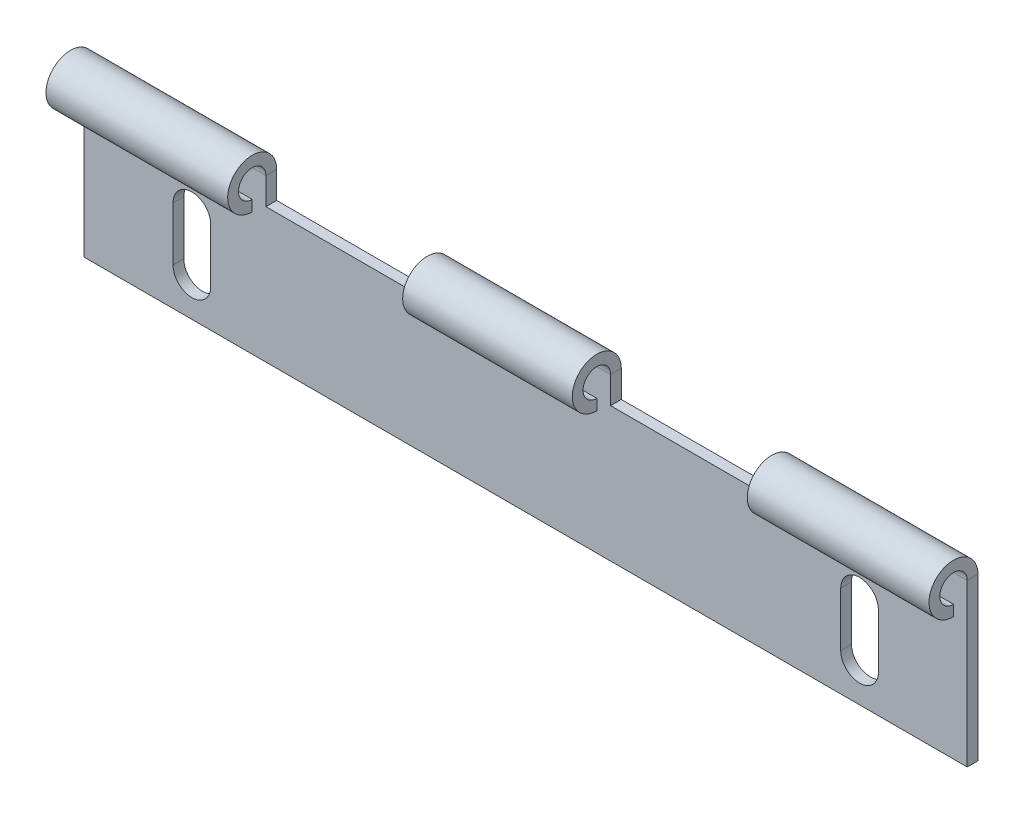
ISO-10303-21;
HEADER;
FILE_DESCRIPTION(('STEP AP214'),'2;1');
FILE_NAME('part.step','',(''),(''),'','','');
FILE_SCHEMA(('AUTOMOTIVE_DESIGN { 1 0 10303 214 1 1 1 1 }'));
ENDSEC;
DATA;
#1=APPLICATION_CONTEXT('core data for automotive mechanical design processes');
#2=APPLICATION_PROTOCOL_DEFINITION('international standard','automotive_design',2000,#1);
#3=PRODUCT_CONTEXT('',#1,'mechanical');
#4=PRODUCT('Part','Part','',(#3));
#5=PRODUCT_RELATED_PRODUCT_CATEGORY('part','',(#4));
#6=PRODUCT_DEFINITION_FORMATION('','',#4);
#7=PRODUCT_DEFINITION_CONTEXT('part definition',#1,'design');
#8=PRODUCT_DEFINITION('design','',#6,#7);
#9=PRODUCT_DEFINITION_SHAPE('','',#8);
#10=(LENGTH_UNIT() NAMED_UNIT(*) SI_UNIT(.MILLI.,.METRE.));
#11=(NAMED_UNIT(*) PLANE_ANGLE_UNIT() SI_UNIT($,.RADIAN.));
#12=(NAMED_UNIT(*) SI_UNIT($,.STERADIAN.) SOLID_ANGLE_UNIT());
#13=UNCERTAINTY_MEASURE_WITH_UNIT(LENGTH_MEASURE(1.E-05),#10,'distance_accuracy_value','');
#14=(GEOMETRIC_REPRESENTATION_CONTEXT(3) GLOBAL_UNCERTAINTY_ASSIGNED_CONTEXT((#13)) GLOBAL_UNIT_ASSIGNED_CONTEXT((#10,
#11,#12)) REPRESENTATION_CONTEXT('',''));
#15=CARTESIAN_POINT('',(0.,0.,0.));
#16=DIRECTION('',(0.,0.,1.));
#17=DIRECTION('',(1.,0.,0.));
#18=AXIS2_PLACEMENT_3D('',#15,#16,#17);
#19=CARTESIAN_POINT('',(-82.,-12.5,-2.));
#20=DIRECTION('',(0.,-1.,0.));
#21=DIRECTION('',(0.,0.,-1.));
#22=AXIS2_PLACEMENT_3D('',#19,#20,#21);
#23=PLANE('',#22);
#24=DIRECTION('',(1.,0.,0.));
#25=VECTOR('',#24,1.);
#26=CARTESIAN_POINT('',(-82.,-12.5,0.));
#27=LINE('',#26,#25);
#28=CARTESIAN_POINT('',(-82.,-12.5,0.));
#29=VERTEX_POINT('',#28);
#30=CARTESIAN_POINT('',(82.,-12.5,0.));
#31=VERTEX_POINT('',#30);
#32=EDGE_CURVE('E356',#29,#31,#27,.T.);
#33=ORIENTED_EDGE('',*,*,#32,.F.);
#34=DIRECTION('',(0.,0.,1.));
#35=VECTOR('',#34,1.);
#36=CARTESIAN_POINT('',(-82.,-12.5,-2.));
#37=LINE('',#36,#35);
#38=CARTESIAN_POINT('',(-82.,-12.5,-2.));
#39=VERTEX_POINT('',#38);
#40=EDGE_CURVE('E48',#39,#29,#37,.T.);
#41=ORIENTED_EDGE('',*,*,#40,.F.);
#42=DIRECTION('',(1.,0.,0.));
#43=VECTOR('',#42,1.);
#44=CARTESIAN_POINT('',(-82.,-12.5,-2.));
#45=LINE('',#44,#43);
#46=CARTESIAN_POINT('',(82.,-12.5,-2.));
#47=VERTEX_POINT('',#46);
#48=EDGE_CURVE('E384',#39,#47,#45,.T.);
#49=ORIENTED_EDGE('',*,*,#48,.T.);
#50=DIRECTION('',(0.,0.,1.));
#51=VECTOR('',#50,1.);
#52=CARTESIAN_POINT('',(82.,-12.5,-2.));
#53=LINE('',#52,#51);
#54=EDGE_CURVE('E11',#47,#31,#53,.T.);
#55=ORIENTED_EDGE('',*,*,#54,.T.);
#56=EDGE_LOOP('',(#33,#41,#49,#55));
#57=FACE_BOUND('',#56,.T.);
#58=ADVANCED_FACE('F39',(#57),#23,.T.);
#59=CARTESIAN_POINT('',(-82.,12.5,-2.));
#60=DIRECTION('',(-1.,0.,0.));
#61=DIRECTION('',(0.,0.,1.));
#62=AXIS2_PLACEMENT_3D('',#59,#60,#61);
#63=PLANE('',#62);
#64=DIRECTION('',(0.,-1.,0.));
#65=VECTOR('',#64,1.);
#66=CARTESIAN_POINT('',(-82.,12.5,0.));
#67=LINE('',#66,#65);
#68=CARTESIAN_POINT('',(-82.,17.5,0.));
#69=VERTEX_POINT('',#68);
#70=EDGE_CURVE('E413',#69,#29,#67,.T.);
#71=ORIENTED_EDGE('',*,*,#70,.F.);
#72=DIRECTION('',(0.,0.,1.));
#73=VECTOR('',#72,1.);
#74=CARTESIAN_POINT('',(-82.,17.5,-2.));
#75=LINE('',#74,#73);
#76=CARTESIAN_POINT('',(-82.,17.5,-2.));
#77=VERTEX_POINT('',#76);
#78=EDGE_CURVE('E419',#77,#69,#75,.T.);
#79=ORIENTED_EDGE('',*,*,#78,.F.);
#80=DIRECTION('',(0.,-1.,0.));
#81=VECTOR('',#80,1.);
#82=CARTESIAN_POINT('',(-82.,12.5,-2.));
#83=LINE('',#82,#81);
#84=EDGE_CURVE('E382',#77,#39,#83,.T.);
#85=ORIENTED_EDGE('',*,*,#84,.T.);
#86=ORIENTED_EDGE('',*,*,#40,.T.);
#87=EDGE_LOOP('',(#71,#79,#85,#86));
#88=FACE_BOUND('',#87,.T.);
#89=ADVANCED_FACE('F511',(#88),#63,.T.);
#90=CARTESIAN_POINT('',(-48.25,17.5,-2.));
#91=DIRECTION('',(1.,0.,0.));
#92=DIRECTION('',(0.,0.,-1.));
#93=AXIS2_PLACEMENT_3D('',#90,#91,#92);
#94=PLANE('',#93);
#95=DIRECTION('',(0.,1.,0.));
#96=VECTOR('',#95,1.);
#97=CARTESIAN_POINT('',(-48.25,17.5,0.));
#98=LINE('',#97,#96);
#99=CARTESIAN_POINT('',(-48.25,12.5,0.));
#100=VERTEX_POINT('',#99);
#101=CARTESIAN_POINT('',(-48.25,17.5,0.));
#102=VERTEX_POINT('',#101);
#103=EDGE_CURVE('E408',#100,#102,#98,.T.);
#104=ORIENTED_EDGE('',*,*,#103,.F.);
#105=DIRECTION('',(0.,0.,1.));
#106=VECTOR('',#105,1.);
#107=CARTESIAN_POINT('',(-48.25,12.5,-2.));
#108=LINE('',#107,#106);
#109=CARTESIAN_POINT('',(-48.25,12.5,-2.));
#110=VERTEX_POINT('',#109);
#111=EDGE_CURVE('E424',#110,#100,#108,.T.);
#112=ORIENTED_EDGE('',*,*,#111,.F.);
#113=DIRECTION('',(0.,1.,0.));
#114=VECTOR('',#113,1.);
#115=CARTESIAN_POINT('',(-48.25,17.5,-2.));
#116=LINE('',#115,#114);
#117=CARTESIAN_POINT('',(-48.25,17.5,-2.));
#118=VERTEX_POINT('',#117);
#119=EDGE_CURVE('E376',#110,#118,#116,.T.);
#120=ORIENTED_EDGE('',*,*,#119,.T.);
#121=DIRECTION('',(0.,0.,1.));
#122=VECTOR('',#121,1.);
#123=CARTESIAN_POINT('',(-48.25,17.5,-2.));
#124=LINE('',#123,#122);
#125=EDGE_CURVE('E422',#118,#102,#124,.T.);
#126=ORIENTED_EDGE('',*,*,#125,.T.);
#127=EDGE_LOOP('',(#104,#112,#120,#126));
#128=FACE_BOUND('',#127,.T.);
#129=ADVANCED_FACE('F531',(#128),#94,.T.);
#130=CARTESIAN_POINT('',(-48.25,12.5,-2.));
#131=DIRECTION('',(0.,1.,0.));
#132=DIRECTION('',(0.,0.,1.));
#133=AXIS2_PLACEMENT_3D('',#130,#131,#132);
#134=PLANE('',#133);
#135=DIRECTION('',(-1.,0.,0.));
#136=VECTOR('',#135,1.);
#137=CARTESIAN_POINT('',(-48.25,12.5,0.));
#138=LINE('',#137,#136);
#139=CARTESIAN_POINT('',(-15.75,12.5,0.));
#140=VERTEX_POINT('',#139);
#141=EDGE_CURVE('E405',#140,#100,#138,.T.);
#142=ORIENTED_EDGE('',*,*,#141,.F.);
#143=DIRECTION('',(0.,0.,1.));
#144=VECTOR('',#143,1.);
#145=CARTESIAN_POINT('',(-15.75,12.5,-2.));
#146=LINE('',#145,#144);
#147=CARTESIAN_POINT('',(-15.75,12.5,-2.));
#148=VERTEX_POINT('',#147);
#149=EDGE_CURVE('E426',#148,#140,#146,.T.);
#150=ORIENTED_EDGE('',*,*,#149,.F.);
#151=DIRECTION('',(-1.,0.,0.));
#152=VECTOR('',#151,1.);
#153=CARTESIAN_POINT('',(-48.25,12.5,-2.));
#154=LINE('',#153,#152);
#155=EDGE_CURVE('E373',#148,#110,#154,.T.);
#156=ORIENTED_EDGE('',*,*,#155,.T.);
#157=ORIENTED_EDGE('',*,*,#111,.T.);
#158=EDGE_LOOP('',(#142,#150,#156,#157));
#159=FACE_BOUND('',#158,.T.);
#160=ADVANCED_FACE('F489',(#159),#134,.T.);
#161=CARTESIAN_POINT('',(-15.75,12.5,-2.));
#162=DIRECTION('',(-1.,0.,0.));
#163=DIRECTION('',(0.,0.,1.));
#164=AXIS2_PLACEMENT_3D('',#161,#162,#163);
#165=PLANE('',#164);
#166=DIRECTION('',(0.,-1.,0.));
#167=VECTOR('',#166,1.);
#168=CARTESIAN_POINT('',(-15.75,12.5,0.));
#169=LINE('',#168,#167);
#170=CARTESIAN_POINT('',(-15.75,17.5,0.));
#171=VERTEX_POINT('',#170);
#172=EDGE_CURVE('E402',#171,#140,#169,.T.);
#173=ORIENTED_EDGE('',*,*,#172,.F.);
#174=DIRECTION('',(0.,0.,1.));
#175=VECTOR('',#174,1.);
#176=CARTESIAN_POINT('',(-15.75,17.5,-2.));
#177=LINE('',#176,#175);
#178=CARTESIAN_POINT('',(-15.75,17.5,-2.));
#179=VERTEX_POINT('',#178);
#180=EDGE_CURVE('E428',#179,#171,#177,.T.);
#181=ORIENTED_EDGE('',*,*,#180,.F.);
#182=DIRECTION('',(0.,-1.,0.));
#183=VECTOR('',#182,1.);
#184=CARTESIAN_POINT('',(-15.75,12.5,-2.));
#185=LINE('',#184,#183);
#186=EDGE_CURVE('E370',#179,#148,#185,.T.);
#187=ORIENTED_EDGE('',*,*,#186,.T.);
#188=ORIENTED_EDGE('',*,*,#149,.T.);
#189=EDGE_LOOP('',(#173,#181,#187,#188));
#190=FACE_BOUND('',#189,.T.);
#191=ADVANCED_FACE('F486',(#190),#165,.T.);
#192=CARTESIAN_POINT('',(15.75,17.5,-2.));
#193=DIRECTION('',(1.,0.,0.));
#194=DIRECTION('',(0.,0.,-1.));
#195=AXIS2_PLACEMENT_3D('',#192,#193,#194);
#196=PLANE('',#195);
#197=DIRECTION('',(0.,1.,0.));
#198=VECTOR('',#197,1.);
#199=CARTESIAN_POINT('',(15.75,17.5,0.));
#200=LINE('',#199,#198);
#201=CARTESIAN_POINT('',(15.75,12.5,0.));
#202=VERTEX_POINT('',#201);
#203=CARTESIAN_POINT('',(15.75,17.5,0.));
#204=VERTEX_POINT('',#203);
#205=EDGE_CURVE('E397',#202,#204,#200,.T.);
#206=ORIENTED_EDGE('',*,*,#205,.F.);
#207=DIRECTION('',(0.,0.,1.));
#208=VECTOR('',#207,1.);
#209=CARTESIAN_POINT('',(15.75,12.5,-2.));
#210=LINE('',#209,#208);
#211=CARTESIAN_POINT('',(15.75,12.5,-2.));
#212=VERTEX_POINT('',#211);
#213=EDGE_CURVE('E432',#212,#202,#210,.T.);
#214=ORIENTED_EDGE('',*,*,#213,.F.);
#215=DIRECTION('',(0.,1.,0.));
#216=VECTOR('',#215,1.);
#217=CARTESIAN_POINT('',(15.75,17.5,-2.));
#218=LINE('',#217,#216);
#219=CARTESIAN_POINT('',(15.75,17.5,-2.));
#220=VERTEX_POINT('',#219);
#221=EDGE_CURVE('E365',#212,#220,#218,.T.);
#222=ORIENTED_EDGE('',*,*,#221,.T.);
#223=DIRECTION('',(0.,0.,1.));
#224=VECTOR('',#223,1.);
#225=CARTESIAN_POINT('',(15.75,17.5,-2.));
#226=LINE('',#225,#224);
#227=EDGE_CURVE('E238',#220,#204,#226,.T.);
#228=ORIENTED_EDGE('',*,*,#227,.T.);
#229=EDGE_LOOP('',(#206,#214,#222,#228));
#230=FACE_BOUND('',#229,.T.);
#231=ADVANCED_FACE('F476',(#230),#196,.T.);
#232=CARTESIAN_POINT('',(15.75,12.5,-2.));
#233=DIRECTION('',(0.,1.,0.));
#234=DIRECTION('',(0.,0.,1.));
#235=AXIS2_PLACEMENT_3D('',#232,#233,#234);
#236=PLANE('',#235);
#237=DIRECTION('',(-1.,0.,0.));
#238=VECTOR('',#237,1.);
#239=CARTESIAN_POINT('',(15.75,12.5,0.));
#240=LINE('',#239,#238);
#241=CARTESIAN_POINT('',(48.25,12.5,0.));
#242=VERTEX_POINT('',#241);
#243=EDGE_CURVE('E394',#242,#202,#240,.T.);
#244=ORIENTED_EDGE('',*,*,#243,.F.);
#245=DIRECTION('',(0.,0.,1.));
#246=VECTOR('',#245,1.);
#247=CARTESIAN_POINT('',(48.25,12.5,-2.));
#248=LINE('',#247,#246);
#249=CARTESIAN_POINT('',(48.25,12.5,-2.));
#250=VERTEX_POINT('',#249);
#251=EDGE_CURVE('E434',#250,#242,#248,.T.);
#252=ORIENTED_EDGE('',*,*,#251,.F.);
#253=DIRECTION('',(-1.,0.,0.));
#254=VECTOR('',#253,1.);
#255=CARTESIAN_POINT('',(15.75,12.5,-2.));
#256=LINE('',#255,#254);
#257=EDGE_CURVE('E362',#250,#212,#256,.T.);
#258=ORIENTED_EDGE('',*,*,#257,.T.);
#259=ORIENTED_EDGE('',*,*,#213,.T.);
#260=EDGE_LOOP('',(#244,#252,#258,#259));
#261=FACE_BOUND('',#260,.T.);
#262=ADVANCED_FACE('F474',(#261),#236,.T.);
#263=CARTESIAN_POINT('',(48.25,17.5,-2.));
#264=DIRECTION('',(-1.,0.,0.));
#265=DIRECTION('',(0.,0.,1.));
#266=AXIS2_PLACEMENT_3D('',#263,#264,#265);
#267=PLANE('',#266);
#268=DIRECTION('',(0.,-1.,0.));
#269=VECTOR('',#268,1.);
#270=CARTESIAN_POINT('',(48.25,17.5,0.));
#271=LINE('',#270,#269);
#272=CARTESIAN_POINT('',(48.25,17.5,0.));
#273=VERTEX_POINT('',#272);
#274=EDGE_CURVE('E391',#273,#242,#271,.T.);
#275=ORIENTED_EDGE('',*,*,#274,.F.);
#276=DIRECTION('',(0.,0.,1.));
#277=VECTOR('',#276,1.);
#278=CARTESIAN_POINT('',(48.25,17.5,-2.));
#279=LINE('',#278,#277);
#280=CARTESIAN_POINT('',(48.25,17.5,-2.));
#281=VERTEX_POINT('',#280);
#282=EDGE_CURVE('E435',#281,#273,#279,.T.);
#283=ORIENTED_EDGE('',*,*,#282,.F.);
#284=DIRECTION('',(0.,-1.,0.));
#285=VECTOR('',#284,1.);
#286=CARTESIAN_POINT('',(48.25,17.5,-2.));
#287=LINE('',#286,#285);
#288=EDGE_CURVE('E359',#281,#250,#287,.T.);
#289=ORIENTED_EDGE('',*,*,#288,.T.);
#290=ORIENTED_EDGE('',*,*,#251,.T.);
#291=EDGE_LOOP('',(#275,#283,#289,#290));
#292=FACE_BOUND('',#291,.T.);
#293=ADVANCED_FACE('F469',(#292),#267,.T.);
#294=CARTESIAN_POINT('',(82.,12.5,-2.));
#295=DIRECTION('',(1.,0.,0.));
#296=DIRECTION('',(0.,0.,-1.));
#297=AXIS2_PLACEMENT_3D('',#294,#295,#296);
#298=PLANE('',#297);
#299=DIRECTION('',(0.,1.,0.));
#300=VECTOR('',#299,1.);
#301=CARTESIAN_POINT('',(82.,12.5,0.));
#302=LINE('',#301,#300);
#303=CARTESIAN_POINT('',(82.,17.5,0.));
#304=VERTEX_POINT('',#303);
#305=EDGE_CURVE('E346',#31,#304,#302,.T.);
#306=ORIENTED_EDGE('',*,*,#305,.F.);
#307=ORIENTED_EDGE('',*,*,#54,.F.);
#308=DIRECTION('',(0.,1.,0.));
#309=VECTOR('',#308,1.);
#310=CARTESIAN_POINT('',(82.,12.5,-2.));
#311=LINE('',#310,#309);
#312=CARTESIAN_POINT('',(82.,17.5,-2.));
#313=VERTEX_POINT('',#312);
#314=EDGE_CURVE('E353',#47,#313,#311,.T.);
#315=ORIENTED_EDGE('',*,*,#314,.T.);
#316=DIRECTION('',(0.,0.,1.));
#317=VECTOR('',#316,1.);
#318=CARTESIAN_POINT('',(82.,17.5,-2.));
#319=LINE('',#318,#317);
#320=EDGE_CURVE('E43',#313,#304,#319,.T.);
#321=ORIENTED_EDGE('',*,*,#320,.T.);
#322=EDGE_LOOP('',(#306,#307,#315,#321));
#323=FACE_BOUND('',#322,.T.);
#324=ADVANCED_FACE('F41',(#323),#298,.T.);
#325=CARTESIAN_POINT('',(0.,0.,-2.));
#326=DIRECTION('',(0.,0.,1.));
#327=DIRECTION('',(1.,0.,0.));
#328=AXIS2_PLACEMENT_3D('',#325,#326,#327);
#329=PLANE('',#328);
#330=DIRECTION('',(0.,1.,0.));
#331=VECTOR('',#330,1.);
#332=CARTESIAN_POINT('',(65.5,4.50000000000001,-2.));
#333=LINE('',#332,#331);
#334=CARTESIAN_POINT('',(65.5,-5.49999999999999,-2.));
#335=VERTEX_POINT('',#334);
#336=CARTESIAN_POINT('',(65.5,4.50000000000001,-2.));
#337=VERTEX_POINT('',#336);
#338=EDGE_CURVE('E300',#335,#337,#333,.T.);
#339=ORIENTED_EDGE('',*,*,#338,.T.);
#340=CARTESIAN_POINT('',(62.,4.50000000000001,-2.));
#341=DIRECTION('',(0.,0.,1.));
#342=DIRECTION('',(1.,0.,0.));
#343=AXIS2_PLACEMENT_3D('',#340,#341,#342);
#344=CIRCLE('',#343,3.5);
#345=CARTESIAN_POINT('',(58.5,4.50000000000001,-2.));
#346=VERTEX_POINT('',#345);
#347=EDGE_CURVE('E292',#337,#346,#344,.T.);
#348=ORIENTED_EDGE('',*,*,#347,.T.);
#349=DIRECTION('',(0.,-1.,0.));
#350=VECTOR('',#349,1.);
#351=CARTESIAN_POINT('',(58.5,4.50000000000001,-2.));
#352=LINE('',#351,#350);
#353=CARTESIAN_POINT('',(58.5,-5.49999999999999,-2.));
#354=VERTEX_POINT('',#353);
#355=EDGE_CURVE('E295',#346,#354,#352,.T.);
#356=ORIENTED_EDGE('',*,*,#355,.T.);
#357=CARTESIAN_POINT('',(62.,-5.49999999999999,-2.));
#358=DIRECTION('',(0.,0.,1.));
#359=DIRECTION('',(1.,0.,0.));
#360=AXIS2_PLACEMENT_3D('',#357,#358,#359);
#361=CIRCLE('',#360,3.5);
#362=EDGE_CURVE('E56',#354,#335,#361,.T.);
#363=ORIENTED_EDGE('',*,*,#362,.T.);
#364=EDGE_LOOP('',(#339,#348,#356,#363));
#365=FACE_BOUND('',#364,.T.);
#366=DIRECTION('',(0.,1.,0.));
#367=VECTOR('',#366,1.);
#368=CARTESIAN_POINT('',(-58.5,4.50000000000001,-2.));
#369=LINE('',#368,#367);
#370=CARTESIAN_POINT('',(-58.5,-5.49999999999999,-2.));
#371=VERTEX_POINT('',#370);
#372=CARTESIAN_POINT('',(-58.5,4.50000000000001,-2.));
#373=VERTEX_POINT('',#372);
#374=EDGE_CURVE('E331',#371,#373,#369,.T.);
#375=ORIENTED_EDGE('',*,*,#374,.T.);
#376=CARTESIAN_POINT('',(-62.,4.50000000000001,-2.));
#377=DIRECTION('',(0.,0.,1.));
#378=DIRECTION('',(1.,0.,0.));
#379=AXIS2_PLACEMENT_3D('',#376,#377,#378);
#380=CIRCLE('',#379,3.5);
#381=CARTESIAN_POINT('',(-65.5,4.50000000000001,-2.));
#382=VERTEX_POINT('',#381);
#383=EDGE_CURVE('E321',#373,#382,#380,.T.);
#384=ORIENTED_EDGE('',*,*,#383,.T.);
#385=DIRECTION('',(0.,-1.,0.));
#386=VECTOR('',#385,1.);
#387=CARTESIAN_POINT('',(-65.5,4.50000000000001,-2.));
#388=LINE('',#387,#386);
#389=CARTESIAN_POINT('',(-65.5,-5.49999999999999,-2.));
#390=VERTEX_POINT('',#389);
#391=EDGE_CURVE('E324',#382,#390,#388,.T.);
#392=ORIENTED_EDGE('',*,*,#391,.T.);
#393=CARTESIAN_POINT('',(-62.,-5.49999999999999,-2.));
#394=DIRECTION('',(0.,0.,1.));
#395=DIRECTION('',(1.,0.,0.));
#396=AXIS2_PLACEMENT_3D('',#393,#394,#395);
#397=CIRCLE('',#396,3.5);
#398=EDGE_CURVE('E328',#390,#371,#397,.T.);
#399=ORIENTED_EDGE('',*,*,#398,.T.);
#400=EDGE_LOOP('',(#375,#384,#392,#399));
#401=FACE_BOUND('',#400,.T.);
#402=ORIENTED_EDGE('',*,*,#314,.F.);
#403=ORIENTED_EDGE('',*,*,#48,.F.);
#404=ORIENTED_EDGE('',*,*,#84,.F.);
#405=DIRECTION('',(-1.,0.,0.));
#406=VECTOR('',#405,1.);
#407=CARTESIAN_POINT('',(-82.,17.5,-2.));
#408=LINE('',#407,#406);
#409=EDGE_CURVE('E379',#118,#77,#408,.T.);
#410=ORIENTED_EDGE('',*,*,#409,.F.);
#411=ORIENTED_EDGE('',*,*,#119,.F.);
#412=ORIENTED_EDGE('',*,*,#155,.F.);
#413=ORIENTED_EDGE('',*,*,#186,.F.);
#414=DIRECTION('',(-1.,0.,0.));
#415=VECTOR('',#414,1.);
#416=CARTESIAN_POINT('',(-15.75,17.5,-2.));
#417=LINE('',#416,#415);
#418=EDGE_CURVE('E368',#220,#179,#417,.T.);
#419=ORIENTED_EDGE('',*,*,#418,.F.);
#420=ORIENTED_EDGE('',*,*,#221,.F.);
#421=ORIENTED_EDGE('',*,*,#257,.F.);
#422=ORIENTED_EDGE('',*,*,#288,.F.);
#423=DIRECTION('',(-1.,0.,0.));
#424=VECTOR('',#423,1.);
#425=CARTESIAN_POINT('',(82.,17.5,-2.));
#426=LINE('',#425,#424);
#427=EDGE_CURVE('E355',#313,#281,#426,.T.);
#428=ORIENTED_EDGE('',*,*,#427,.F.);
#429=EDGE_LOOP('',(#402,#403,#404,#410,#411,#412,#413,#419,#420,#421,#422,#428));
#430=FACE_BOUND('',#429,.T.);
#431=ADVANCED_FACE('F464',(#365,#401,#430),#329,.F.);
#432=CARTESIAN_POINT('',(0.,0.,0.));
#433=DIRECTION('',(0.,0.,1.));
#434=DIRECTION('',(1.,0.,0.));
#435=AXIS2_PLACEMENT_3D('',#432,#433,#434);
#436=PLANE('',#435);
#437=CARTESIAN_POINT('',(62.,4.50000000000001,0.));
#438=DIRECTION('',(0.,0.,1.));
#439=DIRECTION('',(1.,0.,0.));
#440=AXIS2_PLACEMENT_3D('',#437,#438,#439);
#441=CIRCLE('',#440,3.5);
#442=CARTESIAN_POINT('',(65.5,4.50000000000001,0.));
#443=VERTEX_POINT('',#442);
#444=CARTESIAN_POINT('',(58.5,4.50000000000001,0.));
#445=VERTEX_POINT('',#444);
#446=EDGE_CURVE('E64',#443,#445,#441,.T.);
#447=ORIENTED_EDGE('',*,*,#446,.F.);
#448=DIRECTION('',(0.,1.,0.));
#449=VECTOR('',#448,1.);
#450=CARTESIAN_POINT('',(65.5,4.50000000000001,0.));
#451=LINE('',#450,#449);
#452=CARTESIAN_POINT('',(65.5,-5.49999999999999,0.));
#453=VERTEX_POINT('',#452);
#454=EDGE_CURVE('E296',#453,#443,#451,.T.);
#455=ORIENTED_EDGE('',*,*,#454,.F.);
#456=CARTESIAN_POINT('',(62.,-5.49999999999999,0.));
#457=DIRECTION('',(0.,0.,1.));
#458=DIRECTION('',(1.,0.,0.));
#459=AXIS2_PLACEMENT_3D('',#456,#457,#458);
#460=CIRCLE('',#459,3.5);
#461=CARTESIAN_POINT('',(58.5,-5.49999999999999,0.));
#462=VERTEX_POINT('',#461);
#463=EDGE_CURVE('E308',#462,#453,#460,.T.);
#464=ORIENTED_EDGE('',*,*,#463,.F.);
#465=DIRECTION('',(0.,-1.,0.));
#466=VECTOR('',#465,1.);
#467=CARTESIAN_POINT('',(58.5,4.50000000000001,0.));
#468=LINE('',#467,#466);
#469=EDGE_CURVE('E305',#445,#462,#468,.T.);
#470=ORIENTED_EDGE('',*,*,#469,.F.);
#471=EDGE_LOOP('',(#447,#455,#464,#470));
#472=FACE_BOUND('',#471,.T.);
#473=CARTESIAN_POINT('',(-62.,4.50000000000001,0.));
#474=DIRECTION('',(0.,0.,1.));
#475=DIRECTION('',(1.,0.,0.));
#476=AXIS2_PLACEMENT_3D('',#473,#474,#475);
#477=CIRCLE('',#476,3.5);
#478=CARTESIAN_POINT('',(-58.5,4.50000000000001,0.));
#479=VERTEX_POINT('',#478);
#480=CARTESIAN_POINT('',(-65.5,4.50000000000001,0.));
#481=VERTEX_POINT('',#480);
#482=EDGE_CURVE('E315',#479,#481,#477,.T.);
#483=ORIENTED_EDGE('',*,*,#482,.F.);
#484=DIRECTION('',(0.,1.,0.));
#485=VECTOR('',#484,1.);
#486=CARTESIAN_POINT('',(-58.5,4.50000000000001,0.));
#487=LINE('',#486,#485);
#488=CARTESIAN_POINT('',(-58.5,-5.49999999999999,0.));
#489=VERTEX_POINT('',#488);
#490=EDGE_CURVE('E325',#489,#479,#487,.T.);
#491=ORIENTED_EDGE('',*,*,#490,.F.);
#492=CARTESIAN_POINT('',(-62.,-5.49999999999999,0.));
#493=DIRECTION('',(0.,0.,1.));
#494=DIRECTION('',(1.,0.,0.));
#495=AXIS2_PLACEMENT_3D('',#492,#493,#494);
#496=CIRCLE('',#495,3.5);
#497=CARTESIAN_POINT('',(-65.5,-5.49999999999999,0.));
#498=VERTEX_POINT('',#497);
#499=EDGE_CURVE('E339',#498,#489,#496,.T.);
#500=ORIENTED_EDGE('',*,*,#499,.F.);
#501=DIRECTION('',(0.,-1.,0.));
#502=VECTOR('',#501,1.);
#503=CARTESIAN_POINT('',(-65.5,4.50000000000001,0.));
#504=LINE('',#503,#502);
#505=EDGE_CURVE('E336',#481,#498,#504,.T.);
#506=ORIENTED_EDGE('',*,*,#505,.F.);
#507=EDGE_LOOP('',(#483,#491,#500,#506));
#508=FACE_BOUND('',#507,.T.);
#509=ORIENTED_EDGE('',*,*,#32,.T.);
#510=ORIENTED_EDGE('',*,*,#305,.T.);
#511=DIRECTION('',(-1.,0.,0.));
#512=VECTOR('',#511,1.);
#513=CARTESIAN_POINT('',(82.,17.5,0.));
#514=LINE('',#513,#512);
#515=EDGE_CURVE('E389',#304,#273,#514,.T.);
#516=ORIENTED_EDGE('',*,*,#515,.T.);
#517=ORIENTED_EDGE('',*,*,#274,.T.);
#518=ORIENTED_EDGE('',*,*,#243,.T.);
#519=ORIENTED_EDGE('',*,*,#205,.T.);
#520=DIRECTION('',(-1.,0.,0.));
#521=VECTOR('',#520,1.);
#522=CARTESIAN_POINT('',(-15.75,17.5,0.));
#523=LINE('',#522,#521);
#524=EDGE_CURVE('E400',#204,#171,#523,.T.);
#525=ORIENTED_EDGE('',*,*,#524,.T.);
#526=ORIENTED_EDGE('',*,*,#172,.T.);
#527=ORIENTED_EDGE('',*,*,#141,.T.);
#528=ORIENTED_EDGE('',*,*,#103,.T.);
#529=DIRECTION('',(-1.,0.,0.));
#530=VECTOR('',#529,1.);
#531=CARTESIAN_POINT('',(-82.,17.5,0.));
#532=LINE('',#531,#530);
#533=EDGE_CURVE('E411',#102,#69,#532,.T.);
#534=ORIENTED_EDGE('',*,*,#533,.T.);
#535=ORIENTED_EDGE('',*,*,#70,.T.);
#536=EDGE_LOOP('',(#509,#510,#516,#517,#518,#519,#525,#526,#527,#528,#534,#535));
#537=FACE_BOUND('',#536,.T.);
#538=ADVANCED_FACE('F448',(#472,#508,#537),#436,.T.);
#539=CARTESIAN_POINT('',(-62.,4.50000000000001,-2.));
#540=DIRECTION('',(0.,0.,1.));
#541=DIRECTION('',(1.,0.,0.));
#542=AXIS2_PLACEMENT_3D('',#539,#540,#541);
#543=CYLINDRICAL_SURFACE('',#542,3.5);
#544=ORIENTED_EDGE('',*,*,#482,.T.);
#545=DIRECTION('',(0.,0.,1.));
#546=VECTOR('',#545,1.);
#547=CARTESIAN_POINT('',(-65.5,4.50000000000001,-2.));
#548=LINE('',#547,#546);
#549=EDGE_CURVE('E334',#382,#481,#548,.T.);
#550=ORIENTED_EDGE('',*,*,#549,.F.);
#551=ORIENTED_EDGE('',*,*,#383,.F.);
#552=DIRECTION('',(0.,0.,1.));
#553=VECTOR('',#552,1.);
#554=CARTESIAN_POINT('',(-58.5,4.50000000000001,-2.));
#555=LINE('',#554,#553);
#556=EDGE_CURVE('E344',#373,#479,#555,.T.);
#557=ORIENTED_EDGE('',*,*,#556,.T.);
#558=EDGE_LOOP('',(#544,#550,#551,#557));
#559=FACE_BOUND('',#558,.T.);
#560=ADVANCED_FACE('F556',(#559),#543,.F.);
#561=CARTESIAN_POINT('',(-58.5,4.50000000000001,-2.));
#562=DIRECTION('',(1.,0.,0.));
#563=DIRECTION('',(0.,0.,-1.));
#564=AXIS2_PLACEMENT_3D('',#561,#562,#563);
#565=PLANE('',#564);
#566=ORIENTED_EDGE('',*,*,#490,.T.);
#567=ORIENTED_EDGE('',*,*,#556,.F.);
#568=ORIENTED_EDGE('',*,*,#374,.F.);
#569=DIRECTION('',(0.,0.,1.));
#570=VECTOR('',#569,1.);
#571=CARTESIAN_POINT('',(-58.5,-5.49999999999999,-2.));
#572=LINE('',#571,#570);
#573=EDGE_CURVE('E347',#371,#489,#572,.T.);
#574=ORIENTED_EDGE('',*,*,#573,.T.);
#575=EDGE_LOOP('',(#566,#567,#568,#574));
#576=FACE_BOUND('',#575,.T.);
#577=ADVANCED_FACE('F562',(#576),#565,.F.);
#578=CARTESIAN_POINT('',(-62.,-5.49999999999999,-2.));
#579=DIRECTION('',(0.,0.,1.));
#580=DIRECTION('',(1.,0.,0.));
#581=AXIS2_PLACEMENT_3D('',#578,#579,#580);
#582=CYLINDRICAL_SURFACE('',#581,3.5);
#583=ORIENTED_EDGE('',*,*,#499,.T.);
#584=ORIENTED_EDGE('',*,*,#573,.F.);
#585=ORIENTED_EDGE('',*,*,#398,.F.);
#586=DIRECTION('',(0.,0.,1.));
#587=VECTOR('',#586,1.);
#588=CARTESIAN_POINT('',(-65.5,-5.49999999999999,-2.));
#589=LINE('',#588,#587);
#590=EDGE_CURVE('E349',#390,#498,#589,.T.);
#591=ORIENTED_EDGE('',*,*,#590,.T.);
#592=EDGE_LOOP('',(#583,#584,#585,#591));
#593=FACE_BOUND('',#592,.T.);
#594=ADVANCED_FACE('F568',(#593),#582,.F.);
#595=CARTESIAN_POINT('',(-65.5,4.50000000000001,-2.));
#596=DIRECTION('',(-1.,0.,0.));
#597=DIRECTION('',(0.,0.,1.));
#598=AXIS2_PLACEMENT_3D('',#595,#596,#597);
#599=PLANE('',#598);
#600=ORIENTED_EDGE('',*,*,#505,.T.);
#601=ORIENTED_EDGE('',*,*,#590,.F.);
#602=ORIENTED_EDGE('',*,*,#391,.F.);
#603=ORIENTED_EDGE('',*,*,#549,.T.);
#604=EDGE_LOOP('',(#600,#601,#602,#603));
#605=FACE_BOUND('',#604,.T.);
#606=ADVANCED_FACE('F564',(#605),#599,.F.);
#607=CARTESIAN_POINT('',(62.,4.50000000000001,-2.));
#608=DIRECTION('',(0.,0.,1.));
#609=DIRECTION('',(1.,0.,0.));
#610=AXIS2_PLACEMENT_3D('',#607,#608,#609);
#611=CYLINDRICAL_SURFACE('',#610,3.5);
#612=ORIENTED_EDGE('',*,*,#446,.T.);
#613=DIRECTION('',(0.,0.,1.));
#614=VECTOR('',#613,1.);
#615=CARTESIAN_POINT('',(58.5,4.50000000000001,-2.));
#616=LINE('',#615,#614);
#617=EDGE_CURVE('E303',#346,#445,#616,.T.);
#618=ORIENTED_EDGE('',*,*,#617,.F.);
#619=ORIENTED_EDGE('',*,*,#347,.F.);
#620=DIRECTION('',(0.,0.,1.));
#621=VECTOR('',#620,1.);
#622=CARTESIAN_POINT('',(65.5,4.50000000000001,-2.));
#623=LINE('',#622,#621);
#624=EDGE_CURVE('E313',#337,#443,#623,.T.);
#625=ORIENTED_EDGE('',*,*,#624,.T.);
#626=EDGE_LOOP('',(#612,#618,#619,#625));
#627=FACE_BOUND('',#626,.T.);
#628=ADVANCED_FACE('F567',(#627),#611,.F.);
#629=CARTESIAN_POINT('',(65.5,4.50000000000001,-2.));
#630=DIRECTION('',(1.,0.,0.));
#631=DIRECTION('',(0.,0.,-1.));
#632=AXIS2_PLACEMENT_3D('',#629,#630,#631);
#633=PLANE('',#632);
#634=ORIENTED_EDGE('',*,*,#454,.T.);
#635=ORIENTED_EDGE('',*,*,#624,.F.);
#636=ORIENTED_EDGE('',*,*,#338,.F.);
#637=DIRECTION('',(0.,0.,1.));
#638=VECTOR('',#637,1.);
#639=CARTESIAN_POINT('',(65.5,-5.49999999999999,-2.));
#640=LINE('',#639,#638);
#641=EDGE_CURVE('E316',#335,#453,#640,.T.);
#642=ORIENTED_EDGE('',*,*,#641,.T.);
#643=EDGE_LOOP('',(#634,#635,#636,#642));
#644=FACE_BOUND('',#643,.T.);
#645=ADVANCED_FACE('F578',(#644),#633,.F.);
#646=CARTESIAN_POINT('',(62.,-5.49999999999999,-2.));
#647=DIRECTION('',(0.,0.,1.));
#648=DIRECTION('',(1.,0.,0.));
#649=AXIS2_PLACEMENT_3D('',#646,#647,#648);
#650=CYLINDRICAL_SURFACE('',#649,3.5);
#651=ORIENTED_EDGE('',*,*,#463,.T.);
#652=ORIENTED_EDGE('',*,*,#641,.F.);
#653=ORIENTED_EDGE('',*,*,#362,.F.);
#654=DIRECTION('',(0.,0.,1.));
#655=VECTOR('',#654,1.);
#656=CARTESIAN_POINT('',(58.5,-5.49999999999999,-2.));
#657=LINE('',#656,#655);
#658=EDGE_CURVE('E318',#354,#462,#657,.T.);
#659=ORIENTED_EDGE('',*,*,#658,.T.);
#660=EDGE_LOOP('',(#651,#652,#653,#659));
#661=FACE_BOUND('',#660,.T.);
#662=ADVANCED_FACE('F582',(#661),#650,.F.);
#663=CARTESIAN_POINT('',(58.5,4.50000000000001,-2.));
#664=DIRECTION('',(-1.,0.,0.));
#665=DIRECTION('',(0.,0.,1.));
#666=AXIS2_PLACEMENT_3D('',#663,#664,#665);
#667=PLANE('',#666);
#668=ORIENTED_EDGE('',*,*,#469,.T.);
#669=ORIENTED_EDGE('',*,*,#658,.F.);
#670=ORIENTED_EDGE('',*,*,#355,.F.);
#671=ORIENTED_EDGE('',*,*,#617,.T.);
#672=EDGE_LOOP('',(#668,#669,#670,#671));
#673=FACE_BOUND('',#672,.T.);
#674=ADVANCED_FACE('F579',(#673),#667,.F.);
#675=CARTESIAN_POINT('',(-65.125,14.95,2.54999999999997));
#676=DIRECTION('',(0.,0.,1.));
#677=DIRECTION('',(-1.,0.,0.));
#678=AXIS2_PLACEMENT_3D('',#675,#676,#677);
#679=PLANE('',#678);
#680=DIRECTION('',(0.,-1.,0.));
#681=VECTOR('',#680,1.);
#682=CARTESIAN_POINT('',(-82.,14.95,2.54999999999997));
#683=LINE('',#682,#681);
#684=CARTESIAN_POINT('',(-82.,14.95,2.54999999999997));
#685=VERTEX_POINT('',#684);
#686=CARTESIAN_POINT('',(-82.,12.95,2.54999999999995));
#687=VERTEX_POINT('',#686);
#688=EDGE_CURVE('E290',#685,#687,#683,.T.);
#689=ORIENTED_EDGE('',*,*,#688,.F.);
#690=DIRECTION('',(-1.,0.,0.));
#691=VECTOR('',#690,1.);
#692=CARTESIAN_POINT('',(-82.,14.95,2.54999999999997));
#693=LINE('',#692,#691);
#694=CARTESIAN_POINT('',(-48.25,14.95,2.54999999999997));
#695=VERTEX_POINT('',#694);
#696=EDGE_CURVE('E270',#695,#685,#693,.T.);
#697=ORIENTED_EDGE('',*,*,#696,.F.);
#698=DIRECTION('',(0.,-1.,0.));
#699=VECTOR('',#698,1.);
#700=CARTESIAN_POINT('',(-48.25,14.95,2.54999999999997));
#701=LINE('',#700,#699);
#702=CARTESIAN_POINT('',(-48.25,12.95,2.54999999999995));
#703=VERTEX_POINT('',#702);
#704=EDGE_CURVE('E274',#695,#703,#701,.T.);
#705=ORIENTED_EDGE('',*,*,#704,.T.);
#706=DIRECTION('',(-1.,0.,0.));
#707=VECTOR('',#706,1.);
#708=CARTESIAN_POINT('',(-82.,12.95,2.54999999999995));
#709=LINE('',#708,#707);
#710=EDGE_CURVE('E276',#703,#687,#709,.T.);
#711=ORIENTED_EDGE('',*,*,#710,.T.);
#712=EDGE_LOOP('',(#689,#697,#705,#711));
#713=FACE_BOUND('',#712,.T.);
#714=ADVANCED_FACE('F505',(#713),#679,.F.);
#715=CARTESIAN_POINT('',(-48.25,17.5,2.55));
#716=DIRECTION('',(1.,0.,0.));
#717=DIRECTION('',(0.,0.,-1.));
#718=AXIS2_PLACEMENT_3D('',#715,#716,#717);
#719=PLANE('',#718);
#720=ORIENTED_EDGE('',*,*,#704,.F.);
#721=CARTESIAN_POINT('',(-48.25,17.5,2.55));
#722=DIRECTION('',(-1.,0.,0.));
#723=DIRECTION('',(0.,0.,1.));
#724=AXIS2_PLACEMENT_3D('',#721,#722,#723);
#725=CIRCLE('',#724,2.55);
#726=EDGE_CURVE('E279',#102,#695,#725,.F.);
#727=ORIENTED_EDGE('',*,*,#726,.F.);
#728=ORIENTED_EDGE('',*,*,#125,.F.);
#729=CARTESIAN_POINT('',(-48.25,17.5,2.55));
#730=DIRECTION('',(-1.,0.,0.));
#731=DIRECTION('',(0.,0.,1.));
#732=AXIS2_PLACEMENT_3D('',#729,#730,#731);
#733=CIRCLE('',#732,4.55);
#734=EDGE_CURVE('E271',#118,#703,#733,.F.);
#735=ORIENTED_EDGE('',*,*,#734,.T.);
#736=EDGE_LOOP('',(#720,#727,#728,#735));
#737=FACE_BOUND('',#736,.T.);
#738=ADVANCED_FACE('F500',(#737),#719,.T.);
#739=CARTESIAN_POINT('',(-82.,17.5,2.55));
#740=DIRECTION('',(1.,0.,0.));
#741=DIRECTION('',(0.,0.,-1.));
#742=AXIS2_PLACEMENT_3D('',#739,#740,#741);
#743=PLANE('',#742);
#744=CARTESIAN_POINT('',(-82.,17.5,2.55));
#745=DIRECTION('',(-1.,0.,0.));
#746=DIRECTION('',(0.,0.,1.));
#747=AXIS2_PLACEMENT_3D('',#744,#745,#746);
#748=CIRCLE('',#747,2.55);
#749=EDGE_CURVE('E284',#685,#69,#748,.T.);
#750=ORIENTED_EDGE('',*,*,#749,.F.);
#751=ORIENTED_EDGE('',*,*,#688,.T.);
#752=CARTESIAN_POINT('',(-82.,17.5,2.55));
#753=DIRECTION('',(-1.,0.,0.));
#754=DIRECTION('',(0.,0.,1.));
#755=AXIS2_PLACEMENT_3D('',#752,#753,#754);
#756=CIRCLE('',#755,4.55);
#757=EDGE_CURVE('E275',#687,#77,#756,.T.);
#758=ORIENTED_EDGE('',*,*,#757,.T.);
#759=ORIENTED_EDGE('',*,*,#78,.T.);
#760=EDGE_LOOP('',(#750,#751,#758,#759));
#761=FACE_BOUND('',#760,.T.);
#762=ADVANCED_FACE('F507',(#761),#743,.F.);
#763=CARTESIAN_POINT('',(-82.,17.5,2.55));
#764=DIRECTION('',(-1.,0.,0.));
#765=DIRECTION('',(0.,-1.,0.));
#766=AXIS2_PLACEMENT_3D('',#763,#764,#765);
#767=CYLINDRICAL_SURFACE('',#766,4.55);
#768=ORIENTED_EDGE('',*,*,#409,.T.);
#769=ORIENTED_EDGE('',*,*,#757,.F.);
#770=ORIENTED_EDGE('',*,*,#710,.F.);
#771=ORIENTED_EDGE('',*,*,#734,.F.);
#772=EDGE_LOOP('',(#768,#769,#770,#771));
#773=FACE_BOUND('',#772,.T.);
#774=ADVANCED_FACE('F515',(#773),#767,.T.);
#775=CARTESIAN_POINT('',(-82.,17.5,2.55));
#776=DIRECTION('',(-1.,0.,0.));
#777=DIRECTION('',(0.,-1.,0.));
#778=AXIS2_PLACEMENT_3D('',#775,#776,#777);
#779=CYLINDRICAL_SURFACE('',#778,2.55);
#780=ORIENTED_EDGE('',*,*,#533,.F.);
#781=ORIENTED_EDGE('',*,*,#726,.T.);
#782=ORIENTED_EDGE('',*,*,#696,.T.);
#783=ORIENTED_EDGE('',*,*,#749,.T.);
#784=EDGE_LOOP('',(#780,#781,#782,#783));
#785=FACE_BOUND('',#784,.T.);
#786=ADVANCED_FACE('F496',(#785),#779,.F.);
#787=CARTESIAN_POINT('',(65.125,14.95,2.54999999999997));
#788=DIRECTION('',(0.,0.,1.));
#789=DIRECTION('',(-1.,0.,0.));
#790=AXIS2_PLACEMENT_3D('',#787,#788,#789);
#791=PLANE('',#790);
#792=DIRECTION('',(0.,-1.,0.));
#793=VECTOR('',#792,1.);
#794=CARTESIAN_POINT('',(48.25,14.95,2.54999999999997));
#795=LINE('',#794,#793);
#796=CARTESIAN_POINT('',(48.25,14.95,2.54999999999997));
#797=VERTEX_POINT('',#796);
#798=CARTESIAN_POINT('',(48.25,12.95,2.54999999999995));
#799=VERTEX_POINT('',#798);
#800=EDGE_CURVE('E268',#797,#799,#795,.T.);
#801=ORIENTED_EDGE('',*,*,#800,.F.);
#802=DIRECTION('',(-1.,0.,0.));
#803=VECTOR('',#802,1.);
#804=CARTESIAN_POINT('',(48.25,14.95,2.54999999999997));
#805=LINE('',#804,#803);
#806=CARTESIAN_POINT('',(82.,14.95,2.54999999999997));
#807=VERTEX_POINT('',#806);
#808=EDGE_CURVE('E248',#807,#797,#805,.T.);
#809=ORIENTED_EDGE('',*,*,#808,.F.);
#810=DIRECTION('',(0.,-1.,0.));
#811=VECTOR('',#810,1.);
#812=CARTESIAN_POINT('',(82.,14.95,2.54999999999997));
#813=LINE('',#812,#811);
#814=CARTESIAN_POINT('',(82.,12.95,2.54999999999995));
#815=VERTEX_POINT('',#814);
#816=EDGE_CURVE('E252',#807,#815,#813,.T.);
#817=ORIENTED_EDGE('',*,*,#816,.T.);
#818=DIRECTION('',(-1.,0.,0.));
#819=VECTOR('',#818,1.);
#820=CARTESIAN_POINT('',(48.25,12.95,2.54999999999995));
#821=LINE('',#820,#819);
#822=EDGE_CURVE('E254',#815,#799,#821,.T.);
#823=ORIENTED_EDGE('',*,*,#822,.T.);
#824=EDGE_LOOP('',(#801,#809,#817,#823));
#825=FACE_BOUND('',#824,.T.);
#826=ADVANCED_FACE('F457',(#825),#791,.F.);
#827=CARTESIAN_POINT('',(82.,17.5,2.55));
#828=DIRECTION('',(1.,0.,0.));
#829=DIRECTION('',(0.,0.,-1.));
#830=AXIS2_PLACEMENT_3D('',#827,#828,#829);
#831=PLANE('',#830);
#832=ORIENTED_EDGE('',*,*,#816,.F.);
#833=CARTESIAN_POINT('',(82.,17.5,2.55));
#834=DIRECTION('',(-1.,0.,0.));
#835=DIRECTION('',(0.,0.,1.));
#836=AXIS2_PLACEMENT_3D('',#833,#834,#835);
#837=CIRCLE('',#836,2.55);
#838=EDGE_CURVE('E257',#304,#807,#837,.F.);
#839=ORIENTED_EDGE('',*,*,#838,.F.);
#840=ORIENTED_EDGE('',*,*,#320,.F.);
#841=CARTESIAN_POINT('',(82.,17.5,2.55));
#842=DIRECTION('',(-1.,0.,0.));
#843=DIRECTION('',(0.,0.,1.));
#844=AXIS2_PLACEMENT_3D('',#841,#842,#843);
#845=CIRCLE('',#844,4.55);
#846=EDGE_CURVE('E249',#313,#815,#845,.F.);
#847=ORIENTED_EDGE('',*,*,#846,.T.);
#848=EDGE_LOOP('',(#832,#839,#840,#847));
#849=FACE_BOUND('',#848,.T.);
#850=ADVANCED_FACE('F453',(#849),#831,.T.);
#851=CARTESIAN_POINT('',(48.25,17.5,2.55));
#852=DIRECTION('',(1.,0.,0.));
#853=DIRECTION('',(0.,0.,-1.));
#854=AXIS2_PLACEMENT_3D('',#851,#852,#853);
#855=PLANE('',#854);
#856=CARTESIAN_POINT('',(48.25,17.5,2.55));
#857=DIRECTION('',(-1.,0.,0.));
#858=DIRECTION('',(0.,0.,1.));
#859=AXIS2_PLACEMENT_3D('',#856,#857,#858);
#860=CIRCLE('',#859,2.55);
#861=EDGE_CURVE('E262',#797,#273,#860,.T.);
#862=ORIENTED_EDGE('',*,*,#861,.F.);
#863=ORIENTED_EDGE('',*,*,#800,.T.);
#864=CARTESIAN_POINT('',(48.25,17.5,2.55));
#865=DIRECTION('',(-1.,0.,0.));
#866=DIRECTION('',(0.,0.,1.));
#867=AXIS2_PLACEMENT_3D('',#864,#865,#866);
#868=CIRCLE('',#867,4.55);
#869=EDGE_CURVE('E253',#799,#281,#868,.T.);
#870=ORIENTED_EDGE('',*,*,#869,.T.);
#871=ORIENTED_EDGE('',*,*,#282,.T.);
#872=EDGE_LOOP('',(#862,#863,#870,#871));
#873=FACE_BOUND('',#872,.T.);
#874=ADVANCED_FACE('F458',(#873),#855,.F.);
#875=CARTESIAN_POINT('',(48.25,17.5,2.55));
#876=DIRECTION('',(-1.,0.,0.));
#877=DIRECTION('',(0.,-1.,0.));
#878=AXIS2_PLACEMENT_3D('',#875,#876,#877);
#879=CYLINDRICAL_SURFACE('',#878,4.55);
#880=ORIENTED_EDGE('',*,*,#427,.T.);
#881=ORIENTED_EDGE('',*,*,#869,.F.);
#882=ORIENTED_EDGE('',*,*,#822,.F.);
#883=ORIENTED_EDGE('',*,*,#846,.F.);
#884=EDGE_LOOP('',(#880,#881,#882,#883));
#885=FACE_BOUND('',#884,.T.);
#886=ADVANCED_FACE('F461',(#885),#879,.T.);
#887=CARTESIAN_POINT('',(48.25,17.5,2.55));
#888=DIRECTION('',(-1.,0.,0.));
#889=DIRECTION('',(0.,-1.,0.));
#890=AXIS2_PLACEMENT_3D('',#887,#888,#889);
#891=CYLINDRICAL_SURFACE('',#890,2.55);
#892=ORIENTED_EDGE('',*,*,#515,.F.);
#893=ORIENTED_EDGE('',*,*,#838,.T.);
#894=ORIENTED_EDGE('',*,*,#808,.T.);
#895=ORIENTED_EDGE('',*,*,#861,.T.);
#896=EDGE_LOOP('',(#892,#893,#894,#895));
#897=FACE_BOUND('',#896,.T.);
#898=ADVANCED_FACE('F452',(#897),#891,.F.);
#899=CARTESIAN_POINT('',(0.,14.95,2.54999999999997));
#900=DIRECTION('',(0.,0.,1.));
#901=DIRECTION('',(-1.,0.,0.));
#902=AXIS2_PLACEMENT_3D('',#899,#900,#901);
#903=PLANE('',#902);
#904=DIRECTION('',(0.,-1.,0.));
#905=VECTOR('',#904,1.);
#906=CARTESIAN_POINT('',(-15.75,14.95,2.54999999999997));
#907=LINE('',#906,#905);
#908=CARTESIAN_POINT('',(-15.75,14.95,2.54999999999997));
#909=VERTEX_POINT('',#908);
#910=CARTESIAN_POINT('',(-15.75,12.95,2.54999999999995));
#911=VERTEX_POINT('',#910);
#912=EDGE_CURVE('E224',#909,#911,#907,.T.);
#913=ORIENTED_EDGE('',*,*,#912,.F.);
#914=DIRECTION('',(-1.,0.,0.));
#915=VECTOR('',#914,1.);
#916=CARTESIAN_POINT('',(-15.75,14.95,2.54999999999997));
#917=LINE('',#916,#915);
#918=CARTESIAN_POINT('',(15.75,14.95,2.54999999999997));
#919=VERTEX_POINT('',#918);
#920=EDGE_CURVE('E219',#919,#909,#917,.T.);
#921=ORIENTED_EDGE('',*,*,#920,.F.);
#922=DIRECTION('',(0.,-1.,0.));
#923=VECTOR('',#922,1.);
#924=CARTESIAN_POINT('',(15.75,14.95,2.54999999999997));
#925=LINE('',#924,#923);
#926=CARTESIAN_POINT('',(15.75,12.95,2.54999999999995));
#927=VERTEX_POINT('',#926);
#928=EDGE_CURVE('E214',#919,#927,#925,.T.);
#929=ORIENTED_EDGE('',*,*,#928,.T.);
#930=DIRECTION('',(-1.,0.,0.));
#931=VECTOR('',#930,1.);
#932=CARTESIAN_POINT('',(-15.75,12.95,2.54999999999995));
#933=LINE('',#932,#931);
#934=EDGE_CURVE('E217',#927,#911,#933,.T.);
#935=ORIENTED_EDGE('',*,*,#934,.T.);
#936=EDGE_LOOP('',(#913,#921,#929,#935));
#937=FACE_BOUND('',#936,.T.);
#938=ADVANCED_FACE('F216',(#937),#903,.F.);
#939=CARTESIAN_POINT('',(15.75,17.5,2.55));
#940=DIRECTION('',(1.,0.,0.));
#941=DIRECTION('',(0.,0.,-1.));
#942=AXIS2_PLACEMENT_3D('',#939,#940,#941);
#943=PLANE('',#942);
#944=ORIENTED_EDGE('',*,*,#928,.F.);
#945=CARTESIAN_POINT('',(15.75,17.5,2.55));
#946=DIRECTION('',(-1.,0.,0.));
#947=DIRECTION('',(0.,0.,1.));
#948=AXIS2_PLACEMENT_3D('',#945,#946,#947);
#949=CIRCLE('',#948,2.55);
#950=EDGE_CURVE('E234',#204,#919,#949,.F.);
#951=ORIENTED_EDGE('',*,*,#950,.F.);
#952=ORIENTED_EDGE('',*,*,#227,.F.);
#953=CARTESIAN_POINT('',(15.75,17.5,2.55));
#954=DIRECTION('',(-1.,0.,0.));
#955=DIRECTION('',(0.,0.,1.));
#956=AXIS2_PLACEMENT_3D('',#953,#954,#955);
#957=CIRCLE('',#956,4.55);
#958=EDGE_CURVE('E225',#220,#927,#957,.F.);
#959=ORIENTED_EDGE('',*,*,#958,.T.);
#960=EDGE_LOOP('',(#944,#951,#952,#959));
#961=FACE_BOUND('',#960,.T.);
#962=ADVANCED_FACE('F237',(#961),#943,.T.);
#963=CARTESIAN_POINT('',(-15.75,17.5,2.55));
#964=DIRECTION('',(1.,0.,0.));
#965=DIRECTION('',(0.,0.,-1.));
#966=AXIS2_PLACEMENT_3D('',#963,#964,#965);
#967=PLANE('',#966);
#968=CARTESIAN_POINT('',(-15.75,17.5,2.55));
#969=DIRECTION('',(-1.,0.,0.));
#970=DIRECTION('',(0.,0.,1.));
#971=AXIS2_PLACEMENT_3D('',#968,#969,#970);
#972=CIRCLE('',#971,2.55);
#973=EDGE_CURVE('E243',#909,#171,#972,.T.);
#974=ORIENTED_EDGE('',*,*,#973,.F.);
#975=ORIENTED_EDGE('',*,*,#912,.T.);
#976=CARTESIAN_POINT('',(-15.75,17.5,2.55));
#977=DIRECTION('',(-1.,0.,0.));
#978=DIRECTION('',(0.,0.,1.));
#979=AXIS2_PLACEMENT_3D('',#976,#977,#978);
#980=CIRCLE('',#979,4.55);
#981=EDGE_CURVE('E233',#911,#179,#980,.T.);
#982=ORIENTED_EDGE('',*,*,#981,.T.);
#983=ORIENTED_EDGE('',*,*,#180,.T.);
#984=EDGE_LOOP('',(#974,#975,#982,#983));
#985=FACE_BOUND('',#984,.T.);
#986=ADVANCED_FACE('F481',(#985),#967,.F.);
#987=CARTESIAN_POINT('',(-15.75,17.5,2.55));
#988=DIRECTION('',(-1.,0.,0.));
#989=DIRECTION('',(0.,-1.,0.));
#990=AXIS2_PLACEMENT_3D('',#987,#988,#989);
#991=CYLINDRICAL_SURFACE('',#990,4.55);
#992=ORIENTED_EDGE('',*,*,#418,.T.);
#993=ORIENTED_EDGE('',*,*,#981,.F.);
#994=ORIENTED_EDGE('',*,*,#934,.F.);
#995=ORIENTED_EDGE('',*,*,#958,.F.);
#996=EDGE_LOOP('',(#992,#993,#994,#995));
#997=FACE_BOUND('',#996,.T.);
#998=ADVANCED_FACE('F231',(#997),#991,.T.);
#999=CARTESIAN_POINT('',(-15.75,17.5,2.55));
#1000=DIRECTION('',(-1.,0.,0.));
#1001=DIRECTION('',(0.,-1.,0.));
#1002=AXIS2_PLACEMENT_3D('',#999,#1000,#1001);
#1003=CYLINDRICAL_SURFACE('',#1002,2.55);
#1004=ORIENTED_EDGE('',*,*,#524,.F.);
#1005=ORIENTED_EDGE('',*,*,#950,.T.);
#1006=ORIENTED_EDGE('',*,*,#920,.T.);
#1007=ORIENTED_EDGE('',*,*,#973,.T.);
#1008=EDGE_LOOP('',(#1004,#1005,#1006,#1007));
#1009=FACE_BOUND('',#1008,.T.);
#1010=ADVANCED_FACE('F483',(#1009),#1003,.F.);
#1011=CLOSED_SHELL('',(#58,#89,#129,#160,#191,#231,#262,#293,#324,#431,#538,#560,#577,#594,#606,
#628,#645,#662,#674,#714,#738,#762,#774,#786,#826,#850,#874,#886,#898,#938,#962,#986,#998,#1010));
#1012=MANIFOLD_SOLID_BREP('B2',#1011);
#1013=ADVANCED_BREP_SHAPE_REPRESENTATION('',(#18,#1012),#14);
#1014=SHAPE_DEFINITION_REPRESENTATION(#9,#1013);
ENDSEC;
END-ISO-10303-21;
